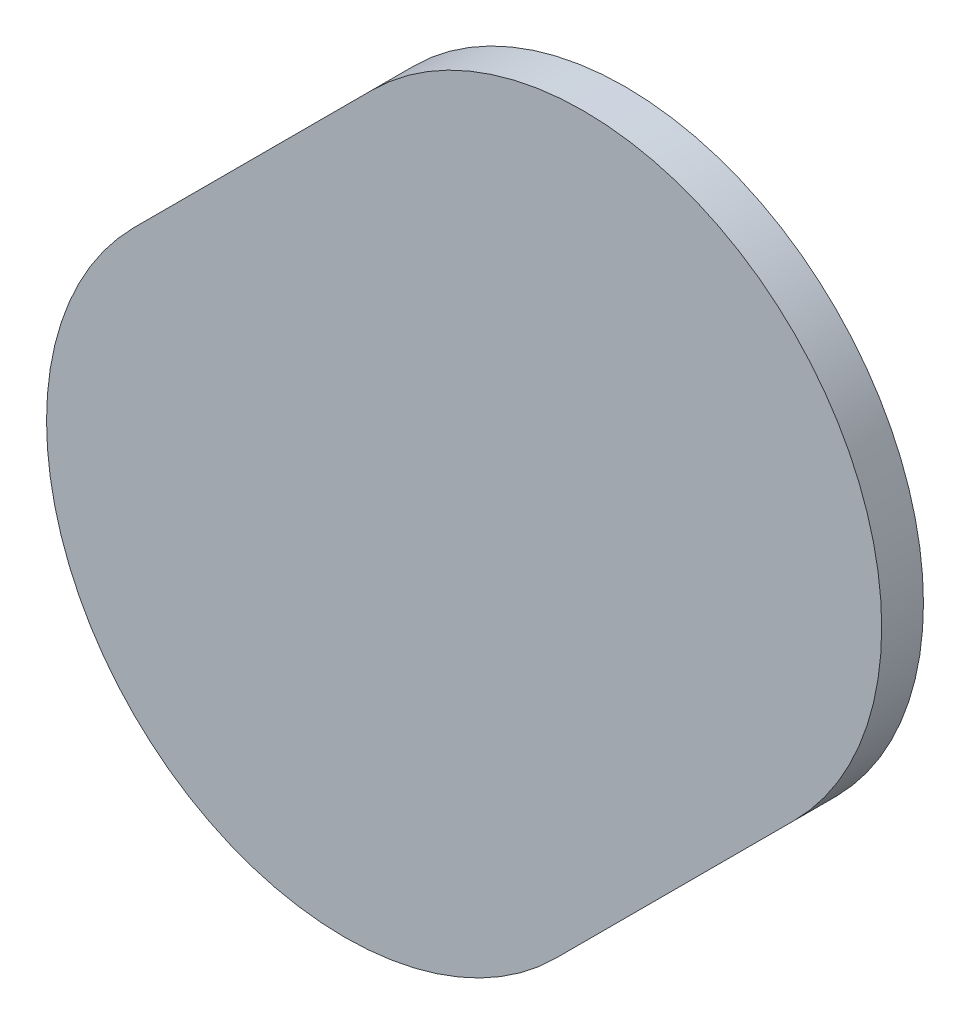
ISO-10303-21;
HEADER;
FILE_DESCRIPTION(('STEP AP214'),'2;1');
FILE_NAME('part.step','',(''),(''),'','','');
FILE_SCHEMA(('AUTOMOTIVE_DESIGN { 1 0 10303 214 1 1 1 1 }'));
ENDSEC;
DATA;
#1=APPLICATION_CONTEXT('core data for automotive mechanical design processes');
#2=APPLICATION_PROTOCOL_DEFINITION('international standard','automotive_design',2000,#1);
#3=PRODUCT_CONTEXT('',#1,'mechanical');
#4=PRODUCT('Part','Part','',(#3));
#5=PRODUCT_RELATED_PRODUCT_CATEGORY('part','',(#4));
#6=PRODUCT_DEFINITION_FORMATION('','',#4);
#7=PRODUCT_DEFINITION_CONTEXT('part definition',#1,'design');
#8=PRODUCT_DEFINITION('design','',#6,#7);
#9=PRODUCT_DEFINITION_SHAPE('','',#8);
#10=(LENGTH_UNIT() NAMED_UNIT(*) SI_UNIT(.MILLI.,.METRE.));
#11=(NAMED_UNIT(*) PLANE_ANGLE_UNIT() SI_UNIT($,.RADIAN.));
#12=(NAMED_UNIT(*) SI_UNIT($,.STERADIAN.) SOLID_ANGLE_UNIT());
#13=UNCERTAINTY_MEASURE_WITH_UNIT(LENGTH_MEASURE(1.E-05),#10,'distance_accuracy_value','');
#14=(GEOMETRIC_REPRESENTATION_CONTEXT(3) GLOBAL_UNCERTAINTY_ASSIGNED_CONTEXT((#13)) GLOBAL_UNIT_ASSIGNED_CONTEXT((#10,
#11,#12)) REPRESENTATION_CONTEXT('',''));
#15=CARTESIAN_POINT('',(0.,0.,0.));
#16=DIRECTION('',(0.,0.,1.));
#17=DIRECTION('',(1.,0.,0.));
#18=AXIS2_PLACEMENT_3D('',#15,#16,#17);
#19=CARTESIAN_POINT('',(98.863223,-106.753224,1.635));
#20=DIRECTION('',(0.,0.,1.));
#21=DIRECTION('',(1.,0.,0.));
#22=AXIS2_PLACEMENT_3D('',#19,#20,#21);
#23=PLANE('',#22);
#24=DIRECTION('',(-0.707106781186548,-0.707106781186548,0.));
#25=VECTOR('',#24,1.);
#26=CARTESIAN_POINT('',(98.863223,-106.753224,1.635));
#27=LINE('',#26,#25);
#28=CARTESIAN_POINT('',(98.863223,-106.753224,1.635));
#29=VERTEX_POINT('',#28);
#30=CARTESIAN_POINT('',(98.663223,-106.953224,1.635));
#31=VERTEX_POINT('',#30);
#32=EDGE_CURVE('E83',#29,#31,#27,.T.);
#33=ORIENTED_EDGE('',*,*,#32,.T.);
#34=CARTESIAN_POINT('',(98.8399995,-107.1300005,1.635));
#35=DIRECTION('',(0.,0.,1.));
#36=DIRECTION('',(-0.707106781186548,0.707106781186548,0.));
#37=AXIS2_PLACEMENT_3D('',#34,#35,#36);
#38=CIRCLE('',#37,0.249999723809);
#39=CARTESIAN_POINT('',(99.016776,-107.306777,1.635));
#40=VERTEX_POINT('',#39);
#41=EDGE_CURVE('E81',#31,#40,#38,.T.);
#42=ORIENTED_EDGE('',*,*,#41,.T.);
#43=DIRECTION('',(0.707106781186548,0.707106781186548,0.));
#44=VECTOR('',#43,1.);
#45=CARTESIAN_POINT('',(99.016776,-107.306777,1.635));
#46=LINE('',#45,#44);
#47=CARTESIAN_POINT('',(99.216776,-107.106777,1.635));
#48=VERTEX_POINT('',#47);
#49=EDGE_CURVE('E70',#40,#48,#46,.T.);
#50=ORIENTED_EDGE('',*,*,#49,.T.);
#51=CARTESIAN_POINT('',(99.0399995,-106.9300005,1.635));
#52=DIRECTION('',(0.,0.,1.));
#53=DIRECTION('',(0.707106781186548,-0.707106781186548,0.));
#54=AXIS2_PLACEMENT_3D('',#51,#52,#53);
#55=CIRCLE('',#54,0.249999723809);
#56=EDGE_CURVE('E11',#48,#29,#55,.T.);
#57=ORIENTED_EDGE('',*,*,#56,.T.);
#58=EDGE_LOOP('',(#33,#42,#50,#57));
#59=FACE_BOUND('',#58,.T.);
#60=ADVANCED_FACE('F17',(#59),#23,.T.);
#61=CARTESIAN_POINT('',(98.863223,-106.753224,1.6));
#62=DIRECTION('',(0.,0.,1.));
#63=DIRECTION('',(1.,0.,0.));
#64=AXIS2_PLACEMENT_3D('',#61,#62,#63);
#65=PLANE('',#64);
#66=CARTESIAN_POINT('',(99.0399995,-106.9300005,1.6));
#67=DIRECTION('',(0.,0.,1.));
#68=DIRECTION('',(0.707106781186548,-0.707106781186548,0.));
#69=AXIS2_PLACEMENT_3D('',#66,#67,#68);
#70=CIRCLE('',#69,0.249999723809);
#71=CARTESIAN_POINT('',(99.216776,-107.106777,1.6));
#72=VERTEX_POINT('',#71);
#73=CARTESIAN_POINT('',(98.863223,-106.753224,1.6));
#74=VERTEX_POINT('',#73);
#75=EDGE_CURVE('E26',#72,#74,#70,.T.);
#76=ORIENTED_EDGE('',*,*,#75,.F.);
#77=DIRECTION('',(0.707106781186548,0.707106781186548,0.));
#78=VECTOR('',#77,1.);
#79=CARTESIAN_POINT('',(99.016776,-107.306777,1.6));
#80=LINE('',#79,#78);
#81=CARTESIAN_POINT('',(99.016776,-107.306777,1.6));
#82=VERTEX_POINT('',#81);
#83=EDGE_CURVE('E63',#82,#72,#80,.T.);
#84=ORIENTED_EDGE('',*,*,#83,.F.);
#85=CARTESIAN_POINT('',(98.8399995,-107.1300005,1.6));
#86=DIRECTION('',(0.,0.,1.));
#87=DIRECTION('',(-0.707106781186548,0.707106781186548,0.));
#88=AXIS2_PLACEMENT_3D('',#85,#86,#87);
#89=CIRCLE('',#88,0.249999723809);
#90=CARTESIAN_POINT('',(98.663223,-106.953224,1.6));
#91=VERTEX_POINT('',#90);
#92=EDGE_CURVE('E90',#91,#82,#89,.T.);
#93=ORIENTED_EDGE('',*,*,#92,.F.);
#94=DIRECTION('',(-0.707106781186548,-0.707106781186548,0.));
#95=VECTOR('',#94,1.);
#96=CARTESIAN_POINT('',(98.863223,-106.753224,1.6));
#97=LINE('',#96,#95);
#98=EDGE_CURVE('E111',#74,#91,#97,.T.);
#99=ORIENTED_EDGE('',*,*,#98,.F.);
#100=EDGE_LOOP('',(#76,#84,#93,#99));
#101=FACE_BOUND('',#100,.T.);
#102=ADVANCED_FACE('F114',(#101),#65,.F.);
#103=CARTESIAN_POINT('',(99.0399995,-106.9300005,1.6));
#104=DIRECTION('',(0.,0.,-1.));
#105=DIRECTION('',(0.707106781186548,-0.707106781186548,0.));
#106=AXIS2_PLACEMENT_3D('',#103,#104,#105);
#107=CYLINDRICAL_SURFACE('',#106,0.249999723809);
#108=ORIENTED_EDGE('',*,*,#75,.T.);
#109=DIRECTION('',(0.,0.,1.));
#110=VECTOR('',#109,1.);
#111=CARTESIAN_POINT('',(98.863223,-106.753224,1.6));
#112=LINE('',#111,#110);
#113=EDGE_CURVE('E97',#74,#29,#112,.T.);
#114=ORIENTED_EDGE('',*,*,#113,.T.);
#115=ORIENTED_EDGE('',*,*,#56,.F.);
#116=DIRECTION('',(0.,0.,1.));
#117=VECTOR('',#116,1.);
#118=CARTESIAN_POINT('',(99.216776,-107.106777,1.6));
#119=LINE('',#118,#117);
#120=EDGE_CURVE('E76',#72,#48,#119,.T.);
#121=ORIENTED_EDGE('',*,*,#120,.F.);
#122=EDGE_LOOP('',(#108,#114,#115,#121));
#123=FACE_BOUND('',#122,.T.);
#124=ADVANCED_FACE('F106',(#123),#107,.T.);
#125=CARTESIAN_POINT('',(99.016776,-107.306777,1.6));
#126=DIRECTION('',(-0.707106781186548,0.707106781186548,0.));
#127=DIRECTION('',(0.,0.,1.));
#128=AXIS2_PLACEMENT_3D('',#125,#126,#127);
#129=PLANE('',#128);
#130=ORIENTED_EDGE('',*,*,#83,.T.);
#131=ORIENTED_EDGE('',*,*,#120,.T.);
#132=ORIENTED_EDGE('',*,*,#49,.F.);
#133=DIRECTION('',(0.,0.,1.));
#134=VECTOR('',#133,1.);
#135=CARTESIAN_POINT('',(99.016776,-107.306777,1.6));
#136=LINE('',#135,#134);
#137=EDGE_CURVE('E74',#82,#40,#136,.T.);
#138=ORIENTED_EDGE('',*,*,#137,.F.);
#139=EDGE_LOOP('',(#130,#131,#132,#138));
#140=FACE_BOUND('',#139,.T.);
#141=ADVANCED_FACE('F72',(#140),#129,.F.);
#142=CARTESIAN_POINT('',(98.8399995,-107.1300005,1.6));
#143=DIRECTION('',(0.,0.,-1.));
#144=DIRECTION('',(-0.707106781186548,0.707106781186548,0.));
#145=AXIS2_PLACEMENT_3D('',#142,#143,#144);
#146=CYLINDRICAL_SURFACE('',#145,0.249999723809);
#147=ORIENTED_EDGE('',*,*,#92,.T.);
#148=ORIENTED_EDGE('',*,*,#137,.T.);
#149=ORIENTED_EDGE('',*,*,#41,.F.);
#150=DIRECTION('',(0.,0.,1.));
#151=VECTOR('',#150,1.);
#152=CARTESIAN_POINT('',(98.663223,-106.953224,1.6));
#153=LINE('',#152,#151);
#154=EDGE_CURVE('E116',#91,#31,#153,.T.);
#155=ORIENTED_EDGE('',*,*,#154,.F.);
#156=EDGE_LOOP('',(#147,#148,#149,#155));
#157=FACE_BOUND('',#156,.T.);
#158=ADVANCED_FACE('F89',(#157),#146,.T.);
#159=CARTESIAN_POINT('',(98.863223,-106.753224,1.6));
#160=DIRECTION('',(0.707106781186548,-0.707106781186548,0.));
#161=DIRECTION('',(0.,0.,-1.));
#162=AXIS2_PLACEMENT_3D('',#159,#160,#161);
#163=PLANE('',#162);
#164=ORIENTED_EDGE('',*,*,#98,.T.);
#165=ORIENTED_EDGE('',*,*,#154,.T.);
#166=ORIENTED_EDGE('',*,*,#32,.F.);
#167=ORIENTED_EDGE('',*,*,#113,.F.);
#168=EDGE_LOOP('',(#164,#165,#166,#167));
#169=FACE_BOUND('',#168,.T.);
#170=ADVANCED_FACE('F110',(#169),#163,.F.);
#171=CLOSED_SHELL('',(#60,#102,#124,#141,#158,#170));
#172=MANIFOLD_SOLID_BREP('B1',#171);
#173=ADVANCED_BREP_SHAPE_REPRESENTATION('',(#18,#172),#14);
#174=SHAPE_DEFINITION_REPRESENTATION(#9,#173);
ENDSEC;
END-ISO-10303-21;
